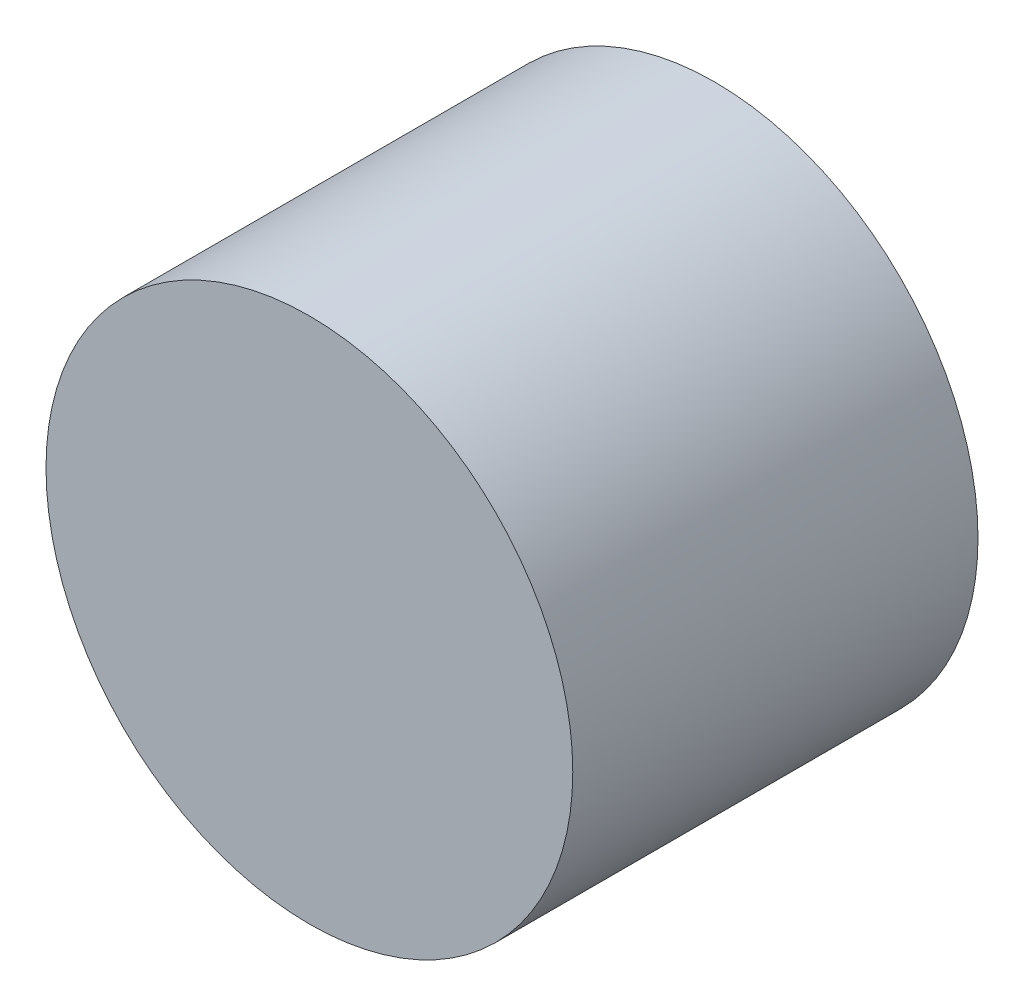
ISO-10303-21;
HEADER;
FILE_DESCRIPTION(('STEP AP214'),'2;1');
FILE_NAME('part.step','',(''),(''),'','','');
FILE_SCHEMA(('AUTOMOTIVE_DESIGN { 1 0 10303 214 1 1 1 1 }'));
ENDSEC;
DATA;
#1=APPLICATION_CONTEXT('core data for automotive mechanical design processes');
#2=APPLICATION_PROTOCOL_DEFINITION('international standard','automotive_design',2000,#1);
#3=PRODUCT_CONTEXT('',#1,'mechanical');
#4=PRODUCT('Part','Part','',(#3));
#5=PRODUCT_RELATED_PRODUCT_CATEGORY('part','',(#4));
#6=PRODUCT_DEFINITION_FORMATION('','',#4);
#7=PRODUCT_DEFINITION_CONTEXT('part definition',#1,'design');
#8=PRODUCT_DEFINITION('design','',#6,#7);
#9=PRODUCT_DEFINITION_SHAPE('','',#8);
#10=(LENGTH_UNIT() NAMED_UNIT(*) SI_UNIT(.MILLI.,.METRE.));
#11=(NAMED_UNIT(*) PLANE_ANGLE_UNIT() SI_UNIT($,.RADIAN.));
#12=(NAMED_UNIT(*) SI_UNIT($,.STERADIAN.) SOLID_ANGLE_UNIT());
#13=UNCERTAINTY_MEASURE_WITH_UNIT(LENGTH_MEASURE(1.E-05),#10,'distance_accuracy_value','');
#14=(GEOMETRIC_REPRESENTATION_CONTEXT(3) GLOBAL_UNCERTAINTY_ASSIGNED_CONTEXT((#13)) GLOBAL_UNIT_ASSIGNED_CONTEXT((#10,
#11,#12)) REPRESENTATION_CONTEXT('',''));
#15=CARTESIAN_POINT('',(0.,0.,0.));
#16=DIRECTION('',(0.,0.,1.));
#17=DIRECTION('',(1.,0.,0.));
#18=AXIS2_PLACEMENT_3D('',#15,#16,#17);
#19=CARTESIAN_POINT('',(0.,0.,20.));
#20=DIRECTION('',(0.,0.,-1.));
#21=DIRECTION('',(-1.,0.,0.));
#22=AXIS2_PLACEMENT_3D('',#19,#20,#21);
#23=CYLINDRICAL_SURFACE('',#22,13.);
#24=CARTESIAN_POINT('',(0.,0.,20.));
#25=DIRECTION('',(0.,0.,1.));
#26=DIRECTION('',(1.,0.,0.));
#27=AXIS2_PLACEMENT_3D('',#24,#25,#26);
#28=CIRCLE('',#27,13.);
#29=CARTESIAN_POINT('',(13.,0.,20.));
#30=VERTEX_POINT('',#29);
#31=EDGE_CURVE('E10',#30,#30,#28,.T.);
#32=ORIENTED_EDGE('',*,*,#31,.F.);
#33=EDGE_LOOP('',(#32));
#34=FACE_BOUND('',#33,.T.);
#35=CARTESIAN_POINT('',(0.,0.,0.));
#36=DIRECTION('',(0.,0.,1.));
#37=DIRECTION('',(1.,0.,0.));
#38=AXIS2_PLACEMENT_3D('',#35,#36,#37);
#39=CIRCLE('',#38,13.);
#40=CARTESIAN_POINT('',(13.,0.,0.));
#41=VERTEX_POINT('',#40);
#42=EDGE_CURVE('E35',#41,#41,#39,.T.);
#43=ORIENTED_EDGE('',*,*,#42,.T.);
#44=EDGE_LOOP('',(#43));
#45=FACE_BOUND('',#44,.T.);
#46=ADVANCED_FACE('F32',(#34,#45),#23,.T.);
#47=CARTESIAN_POINT('',(0.,0.,20.));
#48=DIRECTION('',(0.,0.,1.));
#49=DIRECTION('',(1.,0.,0.));
#50=AXIS2_PLACEMENT_3D('',#47,#48,#49);
#51=PLANE('',#50);
#52=ORIENTED_EDGE('',*,*,#31,.T.);
#53=EDGE_LOOP('',(#52));
#54=FACE_BOUND('',#53,.T.);
#55=ADVANCED_FACE('F47',(#54),#51,.T.);
#56=CARTESIAN_POINT('',(0.,0.,0.));
#57=DIRECTION('',(0.,0.,1.));
#58=DIRECTION('',(1.,0.,0.));
#59=AXIS2_PLACEMENT_3D('',#56,#57,#58);
#60=PLANE('',#59);
#61=ORIENTED_EDGE('',*,*,#42,.F.);
#62=EDGE_LOOP('',(#61));
#63=FACE_BOUND('',#62,.T.);
#64=ADVANCED_FACE('F45',(#63),#60,.F.);
#65=CLOSED_SHELL('',(#46,#55,#64));
#66=MANIFOLD_SOLID_BREP('B2',#65);
#67=ADVANCED_BREP_SHAPE_REPRESENTATION('',(#18,#66),#14);
#68=SHAPE_DEFINITION_REPRESENTATION(#9,#67);
ENDSEC;
END-ISO-10303-21;
